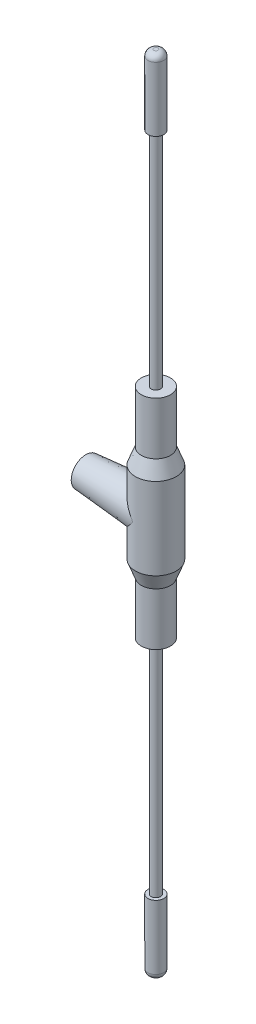
ISO-10303-21;
HEADER;
FILE_DESCRIPTION(('STEP AP214'),'2;1');
FILE_NAME('part.step','',(''),(''),'','','');
FILE_SCHEMA(('AUTOMOTIVE_DESIGN { 1 0 10303 214 1 1 1 1 }'));
ENDSEC;
DATA;
#1=APPLICATION_CONTEXT('core data for automotive mechanical design processes');
#2=APPLICATION_PROTOCOL_DEFINITION('international standard','automotive_design',2000,#1);
#3=PRODUCT_CONTEXT('',#1,'mechanical');
#4=PRODUCT('Part','Part','',(#3));
#5=PRODUCT_RELATED_PRODUCT_CATEGORY('part','',(#4));
#6=PRODUCT_DEFINITION_FORMATION('','',#4);
#7=PRODUCT_DEFINITION_CONTEXT('part definition',#1,'design');
#8=PRODUCT_DEFINITION('design','',#6,#7);
#9=PRODUCT_DEFINITION_SHAPE('','',#8);
#10=(LENGTH_UNIT() NAMED_UNIT(*) SI_UNIT(.MILLI.,.METRE.));
#11=(NAMED_UNIT(*) PLANE_ANGLE_UNIT() SI_UNIT($,.RADIAN.));
#12=(NAMED_UNIT(*) SI_UNIT($,.STERADIAN.) SOLID_ANGLE_UNIT());
#13=UNCERTAINTY_MEASURE_WITH_UNIT(LENGTH_MEASURE(1.E-05),#10,'distance_accuracy_value','');
#14=(GEOMETRIC_REPRESENTATION_CONTEXT(3) GLOBAL_UNCERTAINTY_ASSIGNED_CONTEXT((#13)) GLOBAL_UNIT_ASSIGNED_CONTEXT((#10,
#11,#12)) REPRESENTATION_CONTEXT('',''));
#15=CARTESIAN_POINT('',(0.,0.,0.));
#16=DIRECTION('',(0.,0.,1.));
#17=DIRECTION('',(1.,0.,0.));
#18=AXIS2_PLACEMENT_3D('',#15,#16,#17);
#19=CARTESIAN_POINT('',(-1.34999999999999,-68.6450530372502,0.));
#20=DIRECTION('',(0.,-1.,0.));
#21=DIRECTION('',(1.,0.,0.));
#22=AXIS2_PLACEMENT_3D('',#19,#20,#21);
#23=PLANE('',#22);
#24=CARTESIAN_POINT('',(0.,-68.6450530372502,0.));
#25=DIRECTION('',(0.,-1.,0.));
#26=DIRECTION('',(1.,0.,0.));
#27=AXIS2_PLACEMENT_3D('',#24,#25,#26);
#28=CIRCLE('',#27,0.350000000000007);
#29=CARTESIAN_POINT('',(0.350000000000024,-68.6450530372502,0.));
#30=VERTEX_POINT('',#29);
#31=EDGE_CURVE('E11',#30,#30,#28,.T.);
#32=ORIENTED_EDGE('',*,*,#31,.T.);
#33=EDGE_LOOP('',(#32));
#34=FACE_BOUND('',#33,.T.);
#35=ADVANCED_FACE('F37',(#34),#23,.T.);
#36=CARTESIAN_POINT('',(-1.35000000000001,68.6450530372502,0.));
#37=DIRECTION('',(0.,1.,0.));
#38=DIRECTION('',(-1.,0.,0.));
#39=AXIS2_PLACEMENT_3D('',#36,#37,#38);
#40=PLANE('',#39);
#41=CARTESIAN_POINT('',(0.,68.6450530372502,0.));
#42=DIRECTION('',(0.,1.,0.));
#43=DIRECTION('',(-1.,0.,0.));
#44=AXIS2_PLACEMENT_3D('',#41,#42,#43);
#45=CIRCLE('',#44,0.349999999999991);
#46=CARTESIAN_POINT('',(-0.350000000000008,68.6450530372502,0.));
#47=VERTEX_POINT('',#46);
#48=EDGE_CURVE('E93',#47,#47,#45,.T.);
#49=ORIENTED_EDGE('',*,*,#48,.T.);
#50=EDGE_LOOP('',(#49));
#51=FACE_BOUND('',#50,.T.);
#52=ADVANCED_FACE('F134',(#51),#40,.T.);
#53=CARTESIAN_POINT('',(0.,68.6450530372502,0.));
#54=DIRECTION('',(0.,1.,0.));
#55=DIRECTION('',(-1.,0.,0.));
#56=AXIS2_PLACEMENT_3D('',#53,#54,#55);
#57=CYLINDRICAL_SURFACE('',#56,1.34999999999999);
#58=CARTESIAN_POINT('',(0.,67.6450530372502,0.));
#59=DIRECTION('',(0.,1.,0.));
#60=DIRECTION('',(-1.,0.,0.));
#61=AXIS2_PLACEMENT_3D('',#58,#59,#60);
#62=CIRCLE('',#61,1.34999999999999);
#63=CARTESIAN_POINT('',(-1.35000000000001,67.6450530372502,0.));
#64=VERTEX_POINT('',#63);
#65=EDGE_CURVE('E153',#64,#64,#62,.F.);
#66=ORIENTED_EDGE('',*,*,#65,.T.);
#67=EDGE_LOOP('',(#66));
#68=FACE_BOUND('',#67,.T.);
#69=CARTESIAN_POINT('',(0.,56.6450530372502,0.));
#70=DIRECTION('',(0.,1.,0.));
#71=DIRECTION('',(-1.,0.,0.));
#72=AXIS2_PLACEMENT_3D('',#69,#70,#71);
#73=CIRCLE('',#72,1.34999999999999);
#74=CARTESIAN_POINT('',(-1.35000000000001,56.6450530372502,0.));
#75=VERTEX_POINT('',#74);
#76=EDGE_CURVE('E83',#75,#75,#73,.T.);
#77=ORIENTED_EDGE('',*,*,#76,.T.);
#78=EDGE_LOOP('',(#77));
#79=FACE_BOUND('',#78,.T.);
#80=ADVANCED_FACE('F140',(#68,#79),#57,.T.);
#81=CARTESIAN_POINT('',(-0.800000000000006,56.6450530372502,0.));
#82=DIRECTION('',(0.,-1.,0.));
#83=DIRECTION('',(1.,0.,0.));
#84=AXIS2_PLACEMENT_3D('',#81,#82,#83);
#85=PLANE('',#84);
#86=CARTESIAN_POINT('',(0.,56.6450530372502,0.));
#87=DIRECTION('',(0.,1.,0.));
#88=DIRECTION('',(-1.,0.,0.));
#89=AXIS2_PLACEMENT_3D('',#86,#87,#88);
#90=CIRCLE('',#89,0.799999999999993);
#91=CARTESIAN_POINT('',(-0.800000000000006,56.6450530372502,0.));
#92=VERTEX_POINT('',#91);
#93=EDGE_CURVE('E80',#92,#92,#90,.T.);
#94=ORIENTED_EDGE('',*,*,#93,.T.);
#95=EDGE_LOOP('',(#94));
#96=FACE_BOUND('',#95,.T.);
#97=ORIENTED_EDGE('',*,*,#76,.F.);
#98=EDGE_LOOP('',(#97));
#99=FACE_BOUND('',#98,.T.);
#100=ADVANCED_FACE('F189',(#96,#99),#85,.T.);
#101=CARTESIAN_POINT('',(0.,68.6450530372502,0.));
#102=DIRECTION('',(0.,1.,0.));
#103=DIRECTION('',(-1.,0.,0.));
#104=AXIS2_PLACEMENT_3D('',#101,#102,#103);
#105=CYLINDRICAL_SURFACE('',#104,0.799999999999995);
#106=CARTESIAN_POINT('',(0.,18.6450530372502,0.));
#107=DIRECTION('',(0.,1.,0.));
#108=DIRECTION('',(-1.,0.,0.));
#109=AXIS2_PLACEMENT_3D('',#106,#107,#108);
#110=CIRCLE('',#109,0.799999999999997);
#111=CARTESIAN_POINT('',(-0.800000000000002,18.6450530372502,0.));
#112=VERTEX_POINT('',#111);
#113=EDGE_CURVE('E77',#112,#112,#110,.T.);
#114=ORIENTED_EDGE('',*,*,#113,.T.);
#115=EDGE_LOOP('',(#114));
#116=FACE_BOUND('',#115,.T.);
#117=ORIENTED_EDGE('',*,*,#93,.F.);
#118=EDGE_LOOP('',(#117));
#119=FACE_BOUND('',#118,.T.);
#120=ADVANCED_FACE('F193',(#116,#119),#105,.T.);
#121=CARTESIAN_POINT('',(-2.5,18.6450530372502,0.));
#122=DIRECTION('',(0.,1.,0.));
#123=DIRECTION('',(-1.,0.,0.));
#124=AXIS2_PLACEMENT_3D('',#121,#122,#123);
#125=PLANE('',#124);
#126=CARTESIAN_POINT('',(0.,18.6450530372502,0.));
#127=DIRECTION('',(0.,1.,0.));
#128=DIRECTION('',(-1.,0.,0.));
#129=AXIS2_PLACEMENT_3D('',#126,#127,#128);
#130=CIRCLE('',#129,2.5);
#131=CARTESIAN_POINT('',(-2.5,18.6450530372502,0.));
#132=VERTEX_POINT('',#131);
#133=EDGE_CURVE('E69',#132,#132,#130,.T.);
#134=ORIENTED_EDGE('',*,*,#133,.T.);
#135=EDGE_LOOP('',(#134));
#136=FACE_BOUND('',#135,.T.);
#137=ORIENTED_EDGE('',*,*,#113,.F.);
#138=EDGE_LOOP('',(#137));
#139=FACE_BOUND('',#138,.T.);
#140=ADVANCED_FACE('F199',(#136,#139),#125,.T.);
#141=CARTESIAN_POINT('',(0.,68.6450530372502,0.));
#142=DIRECTION('',(0.,1.,0.));
#143=DIRECTION('',(-1.,0.,0.));
#144=AXIS2_PLACEMENT_3D('',#141,#142,#143);
#145=CYLINDRICAL_SURFACE('',#144,2.5);
#146=CARTESIAN_POINT('',(0.,9.64505303725015,0.));
#147=DIRECTION('',(0.,1.,0.));
#148=DIRECTION('',(-1.,0.,0.));
#149=AXIS2_PLACEMENT_3D('',#146,#147,#148);
#150=CIRCLE('',#149,2.5);
#151=CARTESIAN_POINT('',(-2.5,9.64505303725015,0.));
#152=VERTEX_POINT('',#151);
#153=EDGE_CURVE('E66',#152,#152,#150,.T.);
#154=ORIENTED_EDGE('',*,*,#153,.T.);
#155=EDGE_LOOP('',(#154));
#156=FACE_BOUND('',#155,.T.);
#157=ORIENTED_EDGE('',*,*,#133,.F.);
#158=EDGE_LOOP('',(#157));
#159=FACE_BOUND('',#158,.T.);
#160=ADVANCED_FACE('F205',(#156,#159),#145,.T.);
#161=CARTESIAN_POINT('',(0.,9.64505303725015,0.));
#162=DIRECTION('',(0.,-1.,0.));
#163=DIRECTION('',(1.,0.,0.));
#164=AXIS2_PLACEMENT_3D('',#161,#162,#163);
#165=CONICAL_SURFACE('',#164,2.5,0.361454428294699);
#166=CARTESIAN_POINT('',(0.,7.,0.));
#167=DIRECTION('',(0.,1.,0.));
#168=DIRECTION('',(-1.,0.,0.));
#169=AXIS2_PLACEMENT_3D('',#166,#167,#168);
#170=CIRCLE('',#169,3.5);
#171=CARTESIAN_POINT('',(-3.5,7.,0.));
#172=VERTEX_POINT('',#171);
#173=EDGE_CURVE('E64',#172,#172,#170,.T.);
#174=ORIENTED_EDGE('',*,*,#173,.T.);
#175=EDGE_LOOP('',(#174));
#176=FACE_BOUND('',#175,.T.);
#177=ORIENTED_EDGE('',*,*,#153,.F.);
#178=EDGE_LOOP('',(#177));
#179=FACE_BOUND('',#178,.T.);
#180=ADVANCED_FACE('F55',(#176,#179),#165,.T.);
#181=CARTESIAN_POINT('',(0.,68.6450530372502,0.));
#182=DIRECTION('',(0.,1.,0.));
#183=DIRECTION('',(-1.,0.,0.));
#184=AXIS2_PLACEMENT_3D('',#181,#182,#183);
#185=CYLINDRICAL_SURFACE('',#184,3.5);
#186=CARTESIAN_POINT('',(-2.60949614906665,-2.30966492206223,-2.33249434040178));
#187=CARTESIAN_POINT('',(-2.71781953404462,-2.41922122019186,-2.21130710868468));
#188=CARTESIAN_POINT('',(-2.82046544399447,-2.52291694360074,-2.07950173189472));
#189=CARTESIAN_POINT('',(-3.00990191549178,-2.71417691355314,-1.79436152301762));
#190=CARTESIAN_POINT('',(-3.09670336323236,-2.80175223622898,-1.64104160192255));
#191=CARTESIAN_POINT('',(-3.23320236863166,-2.93942074873517,-1.34789013030215));
#192=CARTESIAN_POINT('',(-3.28686100446216,-2.99352014967703,-1.21183303257941));
#193=CARTESIAN_POINT('',(-3.35497457927908,-3.06218160967978,-0.999837714506521));
#194=CARTESIAN_POINT('',(-3.37561872546223,-3.08298952212982,-0.92784372701138));
#195=CARTESIAN_POINT('',(-3.4124438241706,-3.12010418541856,-0.781602624902478));
#196=CARTESIAN_POINT('',(-3.4286267097356,-3.13641288574346,-0.707356501655439));
#197=CARTESIAN_POINT('',(-3.45632157179874,-3.16432177733867,-0.556561005602214));
#198=CARTESIAN_POINT('',(-3.46779961612868,-3.17588776351682,-0.479999034473181));
#199=CARTESIAN_POINT('',(-3.48567555165178,-3.19390020587876,-0.32571995651793));
#200=CARTESIAN_POINT('',(-3.49207574628518,-3.20034898335722,-0.248003389763019));
#201=CARTESIAN_POINT('',(-3.49965948268216,-3.20799025631259,-0.0920532082651245));
#202=CARTESIAN_POINT('',(-3.50084309903998,-3.2091828269504,-0.0138196009315634));
#203=CARTESIAN_POINT('',(-3.49797535310031,-3.20629333983764,0.142428590227469));
#204=CARTESIAN_POINT('',(-3.49392438598221,-3.20221168025953,0.220443190141096));
#205=CARTESIAN_POINT('',(-3.47539018983816,-3.18353652254281,0.43713126191369));
#206=CARTESIAN_POINT('',(-3.45518457792113,-3.16317686092761,0.574894234541606));
#207=CARTESIAN_POINT('',(-3.39951982661579,-3.10707957355299,0.843917785784003));
#208=CARTESIAN_POINT('',(-3.36405804736898,-3.07133928639905,0.975177234672558));
#209=CARTESIAN_POINT('',(-3.27783084739847,-2.9844158091981,1.23510678029004));
#210=CARTESIAN_POINT('',(-3.22639153749221,-2.9325524881658,1.36332277840809));
#211=CARTESIAN_POINT('',(-3.11154549449944,-2.81672054769149,1.60830206683396));
#212=CARTESIAN_POINT('',(-3.04813329002579,-2.7527463937918,1.72506008384132));
#213=CARTESIAN_POINT('',(-2.87392637422232,-2.57691475369059,2.00781486989971));
#214=CARTESIAN_POINT('',(-2.75630973218524,-2.45813016894066,2.16537517206756));
#215=CARTESIAN_POINT('',(-2.56799566202664,-2.267699403118,2.38002757625814));
#216=CARTESIAN_POINT('',(-2.5031087910283,-2.20204437026227,2.44807168614128));
#217=CARTESIAN_POINT('',(-2.37000841451182,-2.06725059471422,2.57713763322638));
#218=CARTESIAN_POINT('',(-2.30179506857581,-1.99811201913384,2.63815980682322));
#219=CARTESIAN_POINT('',(-2.13637995844069,-1.83024658018113,2.77513628837944));
#220=CARTESIAN_POINT('',(-2.03796445909086,-1.73021141954932,2.84801959413556));
#221=CARTESIAN_POINT('',(-1.83733246298702,-1.52571205438781,2.98139493531115));
#222=CARTESIAN_POINT('',(-1.73511381573173,-1.42124533919579,3.04187983022352));
#223=CARTESIAN_POINT('',(-1.52838436378199,-1.20876743126781,3.15082390940085));
#224=CARTESIAN_POINT('',(-1.42387715670192,-1.10076168543886,3.19930067392478));
#225=CARTESIAN_POINT('',(-1.21387364107492,-0.881325760814849,3.28470047331082));
#226=CARTESIAN_POINT('',(-1.10837814733583,-0.769898255497645,3.32163228827582));
#227=CARTESIAN_POINT('',(-0.962629666966195,-0.609805444834193,3.36530252906266));
#228=CARTESIAN_POINT('',(-0.921152957515908,-0.56353126142878,3.37687455407678));
#229=CARTESIAN_POINT('',(-0.839360387986565,-0.469425044482306,3.39812306410195));
#230=CARTESIAN_POINT('',(-0.799045548938595,-0.421591714986809,3.40779792279015));
#231=CARTESIAN_POINT('',(-0.738272690180344,-0.344181682477016,3.42132595744596));
#232=CARTESIAN_POINT('',(-0.716724726490901,-0.31559016769022,3.42589454089639));
#233=CARTESIAN_POINT('',(-0.675653364742439,-0.256894680153938,3.43422814650198));
#234=CARTESIAN_POINT('',(-0.656125727548742,-0.226794079440237,3.43799486948422));
#235=CARTESIAN_POINT('',(-0.628066201662092,-0.176301667412165,3.4432038167172));
#236=CARTESIAN_POINT('',(-0.61821444284516,-0.156696257074171,3.44497992036702));
#237=CARTESIAN_POINT('',(-0.601123465939705,-0.116340233588428,3.44800311255474));
#238=CARTESIAN_POINT('',(-0.593876585234409,-0.0955931898253101,3.44925175462596));
#239=CARTESIAN_POINT('',(-0.584548290155964,-0.0577755391156096,3.45084358146755));
#240=CARTESIAN_POINT('',(-0.581676088810319,-0.040914711325907,3.45132645755126));
#241=CARTESIAN_POINT('',(-0.578905462143215,-0.00695541568091769,3.45179243622523));
#242=CARTESIAN_POINT('',(-0.579002041902626,0.010142604647835,3.45177637826228));
#243=CARTESIAN_POINT('',(-0.582125054166049,0.0439910793076151,3.45125077458377));
#244=CARTESIAN_POINT('',(-0.585142637381841,0.0607424273681859,3.45074271939014));
#245=CARTESIAN_POINT('',(-0.593556528094491,0.093629943363963,3.44930570666274));
#246=CARTESIAN_POINT('',(-0.598958411608624,0.109764572330099,3.4483757623399));
#247=CARTESIAN_POINT('',(-0.622380880254753,0.169217942813282,3.44426023686765));
#248=CARTESIAN_POINT('',(-0.645833747825696,0.210199929662712,3.43999229679418));
#249=CARTESIAN_POINT('',(-0.697191911248009,0.289179506090962,3.42996277964079));
#250=CARTESIAN_POINT('',(-0.725140375737289,0.327142204487347,3.42418634285844));
#251=CARTESIAN_POINT('',(-0.78676956543944,0.406246381828381,3.41058815571182));
#252=CARTESIAN_POINT('',(-0.820721670574929,0.447153132594018,3.40259762461275));
#253=CARTESIAN_POINT('',(-0.889718396711673,0.527735832461666,3.38521459967457));
#254=CARTESIAN_POINT('',(-0.924763825221643,0.567410826491635,3.37582104922151));
#255=CARTESIAN_POINT('',(-1.03073814554478,0.685364235218359,3.34558865476176));
#256=CARTESIAN_POINT('',(-1.10241430197052,0.762462969004495,3.32271756243427));
#257=CARTESIAN_POINT('',(-1.24568146718776,0.91455745592573,3.27170782240247));
#258=CARTESIAN_POINT('',(-1.31727222239841,0.989558098438658,3.24358284428107));
#259=CARTESIAN_POINT('',(-1.45981655658942,1.13784460661524,3.18197377911078));
#260=CARTESIAN_POINT('',(-1.53077052528836,1.21113157245469,3.14849324497665));
#261=CARTESIAN_POINT('',(-1.69903338507688,1.3842504271775,3.06192706322867));
#262=CARTESIAN_POINT('',(-1.79584421084335,1.48330438038636,3.00628430957384));
#263=CARTESIAN_POINT('',(-1.98635024968953,1.6776725206095,2.88396229580617));
#264=CARTESIAN_POINT('',(-2.08004367983374,1.77298457293655,2.81727684604077));
#265=CARTESIAN_POINT('',(-2.26305466430302,1.95884403601416,2.67248606250255));
#266=CARTESIAN_POINT('',(-2.35237659053347,2.04939621407898,2.59439246293458));
#267=CARTESIAN_POINT('',(-2.52535379940022,2.22457059558746,2.42633918170663));
#268=CARTESIAN_POINT('',(-2.60901319040374,2.30919709988697,2.33638824570698));
#269=CARTESIAN_POINT('',(-2.78847587217008,2.49060862314382,2.12096723890712));
#270=CARTESIAN_POINT('',(-2.88234988829161,2.58541176788445,1.99216064485974));
#271=CARTESIAN_POINT('',(-3.05503678374751,2.75971861659173,1.71559334540337));
#272=CARTESIAN_POINT('',(-3.13387298800664,2.83924601590083,1.5678625978975));
#273=CARTESIAN_POINT('',(-3.26039728243529,2.96684105538658,1.28067010422609));
#274=CARTESIAN_POINT('',(-3.3110847339662,3.0179407630374,1.14391633045995));
#275=CARTESIAN_POINT('',(-3.37462376375616,3.08198684291185,0.93134776494629));
#276=CARTESIAN_POINT('',(-3.39372516242452,3.10123873022476,0.85922980931241));
#277=CARTESIAN_POINT('',(-3.42744312896855,3.13522025196905,0.71292258430573));
#278=CARTESIAN_POINT('',(-3.44206163797803,3.14995184373303,0.6387342266623));
#279=CARTESIAN_POINT('',(-3.46661262161866,3.17469177163347,0.488306245256146));
#280=CARTESIAN_POINT('',(-3.47651449790497,3.18466926650622,0.412056530122202));
#281=CARTESIAN_POINT('',(-3.4912832207013,3.19955049089204,0.258611013343632));
#282=CARTESIAN_POINT('',(-3.49615228444511,3.20445645469667,0.18141564349249));
#283=CARTESIAN_POINT('',(-3.50075296778359,3.20909201296992,0.0267114616619918));
#284=CARTESIAN_POINT('',(-3.50048460408674,3.2088216242736,-0.0507973492971384));
#285=CARTESIAN_POINT('',(-3.4948250096166,3.2031191086893,-0.205412343905618));
#286=CARTESIAN_POINT('',(-3.48943411276203,3.19768731825373,-0.282518553469621));
#287=CARTESIAN_POINT('',(-3.4672565376507,3.17534072472731,-0.497377504936457));
#288=CARTESIAN_POINT('',(-3.44479136915351,3.15270372351301,-0.634023095062513));
#289=CARTESIAN_POINT('',(-3.38495755560253,3.092402908041,-0.900424574482895));
#290=CARTESIAN_POINT('',(-3.34758598121708,3.05473614020888,-1.0301791038982));
#291=CARTESIAN_POINT('',(-3.25726892327002,2.96368471204027,-1.28843251062069));
#292=CARTESIAN_POINT('',(-3.20349366529789,2.90946240797821,-1.41634221965479));
#293=CARTESIAN_POINT('',(-3.08411426670854,2.789047282223,-1.66034212204034));
#294=CARTESIAN_POINT('',(-3.01850471814211,2.72284898778638,-1.77642687360032));
#295=CARTESIAN_POINT('',(-2.83785226080649,2.54048609595921,-2.05874545580744));
#296=CARTESIAN_POINT('',(-2.7158790762913,2.4172783503192,-2.21607527312337));
#297=CARTESIAN_POINT('',(-2.52111716883902,2.22026734579953,-2.4296762237788));
#298=CARTESIAN_POINT('',(-2.45408614161922,2.1524184102102,-2.49725483405189));
#299=CARTESIAN_POINT('',(-2.31673775959071,2.01325804327434,-2.625170305153));
#300=CARTESIAN_POINT('',(-2.24642049045298,1.94194670218943,-2.68550735461939));
#301=CARTESIAN_POINT('',(-2.07639818374142,1.76928804612033,-2.82034477674984));
#302=CARTESIAN_POINT('',(-1.97551895242748,1.66666307831179,-2.89172772344638));
#303=CARTESIAN_POINT('',(-1.77015320032139,1.45704305324458,-3.02181099122809));
#304=CARTESIAN_POINT('',(-1.66566508926506,1.35004606553998,-3.08050563630117));
#305=CARTESIAN_POINT('',(-1.45463774687206,1.1326035996737,-3.18557052171892));
#306=CARTESIAN_POINT('',(-1.34810354120317,1.02216623773275,-3.23196762761589));
#307=CARTESIAN_POINT('',(-1.18809350595403,0.853573746701477,-3.29267333161253));
#308=CARTESIAN_POINT('',(-1.13471762199692,0.796882037317633,-3.31142808907757));
#309=CARTESIAN_POINT('',(-1.02836250444108,0.68224426246676,-3.34598014333621));
#310=CARTESIAN_POINT('',(-0.975383179027257,0.624298500251966,-3.36177814640435));
#311=CARTESIAN_POINT('',(-0.887777417363474,0.525428628414402,-3.38573496347006));
#312=CARTESIAN_POINT('',(-0.852751669468628,0.485053737859607,-3.39471282062441));
#313=CARTESIAN_POINT('',(-0.784152392783869,0.402831821848775,-3.41120703844176));
#314=CARTESIAN_POINT('',(-0.750577158210431,0.360986636650632,-3.41872515424427));
#315=CARTESIAN_POINT('',(-0.700283797411126,0.292547527206041,-3.42928044039058));
#316=CARTESIAN_POINT('',(-0.682395958804961,0.266907799577191,-3.43287541405798));
#317=CARTESIAN_POINT('',(-0.648814113161121,0.214078919038872,-3.43937892844614));
#318=CARTESIAN_POINT('',(-0.633119326788893,0.186890321403776,-3.44228771326879));
#319=CARTESIAN_POINT('',(-0.61111382424878,0.14075400414171,-3.44624675538599));
#320=CARTESIAN_POINT('',(-0.603480091659787,0.122481797211757,-3.44758639279448));
#321=CARTESIAN_POINT('',(-0.59093686358519,0.0850094031582989,-3.44975861339184));
#322=CARTESIAN_POINT('',(-0.586018144788897,0.0658126017544061,-3.45059291423727));
#323=CARTESIAN_POINT('',(-0.580341041768719,0.0295633139205476,-3.45155212859246));
#324=CARTESIAN_POINT('',(-0.579090593657584,0.0125939912525814,-3.45176103388426));
#325=CARTESIAN_POINT('',(-0.579594874952973,-0.0212876358410198,-3.45167636967833));
#326=CARTESIAN_POINT('',(-0.581348262274476,-0.0381999623495394,-3.45138302458133));
#327=CARTESIAN_POINT('',(-0.588522701344562,-0.0770541674508179,-3.4501677023245));
#328=CARTESIAN_POINT('',(-0.594972032688519,-0.0987920513311159,-3.44906868048236));
#329=CARTESIAN_POINT('',(-0.611028491866295,-0.141076578971758,-3.44626037126231));
#330=CARTESIAN_POINT('',(-0.620653842305737,-0.161615524022193,-3.44454755721638));
#331=CARTESIAN_POINT('',(-0.649435253034837,-0.216167225285983,-3.43926888715873));
#332=CARTESIAN_POINT('',(-0.670436008446379,-0.249131570425273,-3.43526069257075));
#333=CARTESIAN_POINT('',(-0.714905808313501,-0.313244897306379,-3.42628637304679));
#334=CARTESIAN_POINT('',(-0.73838237069011,-0.344387875813048,-3.42131728988756));
#335=CARTESIAN_POINT('',(-0.810862451825432,-0.436494532694653,-3.40513403191238));
#336=CARTESIAN_POINT('',(-0.861691345462394,-0.495795457585403,-3.39268273300867));
#337=CARTESIAN_POINT('',(-0.964661961071323,-0.612349242425516,-3.36486367991904));
#338=CARTESIAN_POINT('',(-1.01680228699123,-0.669604135260466,-3.3494989219544));
#339=CARTESIAN_POINT('',(-1.12155310218693,-0.782831657344465,-3.31589200652221));
#340=CARTESIAN_POINT('',(-1.17416359968576,-0.838804264105771,-3.29764979863633));
#341=CARTESIAN_POINT('',(-1.33206732280625,-1.00542671098044,-3.23855499650725));
#342=CARTESIAN_POINT('',(-1.43729701364955,-1.11463319924475,-3.19337010489927));
#343=CARTESIAN_POINT('',(-1.6451076680346,-1.32894225646303,-3.09143549708765));
#344=CARTESIAN_POINT('',(-1.74769928634475,-1.4340626939136,-3.03474505040323));
#345=CARTESIAN_POINT('',(-1.94945307754586,-1.6401061910222,-2.90924892820463));
#346=CARTESIAN_POINT('',(-2.04861856008513,-1.74103332166181,-2.84045535936743));
#347=CARTESIAN_POINT('',(-2.2266235990024,-1.92186848816756,-2.70235066586925));
#348=CARTESIAN_POINT('',(-2.30615465209788,-2.0025340689475,-2.63492649230814));
#349=CARTESIAN_POINT('',(-2.46114887041834,-2.15957554358803,-2.49077513260074));
#350=CARTESIAN_POINT('',(-2.536607788002,-2.23594696156274,-2.41403849362056));
#351=CARTESIAN_POINT('',(-2.60949614906665,-2.30966492206223,-2.33249434040178));
#352=B_SPLINE_CURVE_WITH_KNOTS('',3,(#186,#187,#188,#189,#190,#191,#192,#193,#194,#195,#196,
#197,#198,#199,#200,#201,#202,#203,#204,#205,#206,#207,#208,#209,#210,#211,#212,#213,#214,#215,
#216,#217,#218,#219,#220,#221,#222,#223,#224,#225,#226,#227,#228,#229,#230,#231,#232,#233,#234,
#235,#236,#237,#238,#239,#240,#241,#242,#243,#244,#245,#246,#247,#248,#249,#250,#251,#252,#253,
#254,#255,#256,#257,#258,#259,#260,#261,#262,#263,#264,#265,#266,#267,#268,#269,#270,#271,#272,
#273,#274,#275,#276,#277,#278,#279,#280,#281,#282,#283,#284,#285,#286,#287,#288,#289,#290,#291,
#292,#293,#294,#295,#296,#297,#298,#299,#300,#301,#302,#303,#304,#305,#306,#307,#308,#309,#310,
#311,#312,#313,#314,#315,#316,#317,#318,#319,#320,#321,#322,#323,#324,#325,#326,#327,#328,#329,
#330,#331,#332,#333,#334,#335,#336,#337,#338,#339,#340,#341,#342,#343,#344,#345,#346,#347,#348,
#349,#350,#351),.UNSPECIFIED.,.T.,.F.,(4,2,2,2,2,2,2,2,2,2,2,2,2,2,2,2,2,2,2,2,2,2,2,2,2,2,2,2,
2,2,2,2,2,2,2,2,2,2,2,2,2,2,2,2,2,2,2,2,2,2,2,2,2,2,2,2,2,2,2,2,2,2,2,2,2,2,2,2,2,2,2,2,2,2,2,2,
2,2,2,2,2,2,4),(0.,0.587709186042243,1.17501304452192,1.64078096157125,1.87372996931262,
2.10657788230983,2.3410767791915,2.57546924056287,2.80985835023791,3.04422976598699,
3.46428506995355,3.88441308765098,4.32545329078819,4.7666955309419,5.45172279774003,
5.7955389181961,6.1393385608363,6.61305321174101,7.08703992312637,7.56032854718177,
8.03325634766969,8.22286443028851,8.41263434832163,8.52087662261212,8.62888696460616,
8.69481623746831,8.76054995149918,8.81164989614923,8.86266387080363,8.91352377886619,
8.96450326535406,9.10555343417124,9.24804919905742,9.40920497061662,9.57048272632512,
9.89346503520243,10.2156184248627,10.5375589752858,10.9848827138361,11.4324580403324,
11.8795761992455,12.326366401728,12.8807844065352,13.4343353416907,13.8958644706681,
14.1267637410854,14.3575628882867,14.5898395739444,14.8220138851335,15.0541874412214,
15.2863458638246,15.7052485953399,16.1242336880957,16.5694971820348,17.014964667174,
17.7131136982449,18.0635679045676,18.4140129797826,18.8952389367024,19.3766797228311,
19.85705990504,20.0972896878863,20.337462014039,20.5000376285325,20.662416540846,
20.7567743243938,20.8510984907196,20.9105027263912,20.9697038950184,21.0204882666252,
21.0712499541761,21.1389432897586,21.2070319770941,21.3245730889565,21.4424819998075,
21.6795241789065,21.9163238915019,22.1531277537339,22.6273458334322,23.0991803624686,
23.5705455743781,23.9655974075321,24.3610536551555),.UNSPECIFIED.);
#353=CARTESIAN_POINT('',(-2.60949614906665,-2.30966492206223,-2.33249434040178));
#354=VERTEX_POINT('',#353);
#355=EDGE_CURVE('E86',#354,#354,#352,.T.);
#356=ORIENTED_EDGE('',*,*,#355,.F.);
#357=EDGE_LOOP('',(#356));
#358=FACE_BOUND('',#357,.T.);
#359=CARTESIAN_POINT('',(0.,0.,-3.5));
#360=VERTEX_POINT('',#359);
#361=VERTEX_LOOP('',#360);
#362=FACE_BOUND('',#361,.T.);
#363=CARTESIAN_POINT('',(0.,0.,3.5));
#364=VERTEX_POINT('',#363);
#365=VERTEX_LOOP('',#364);
#366=FACE_BOUND('',#365,.T.);
#367=CARTESIAN_POINT('',(0.,-6.99999999999999,0.));
#368=DIRECTION('',(0.,1.,0.));
#369=DIRECTION('',(-1.,0.,0.));
#370=AXIS2_PLACEMENT_3D('',#367,#368,#369);
#371=CIRCLE('',#370,3.5);
#372=CARTESIAN_POINT('',(-3.5,-6.99999999999999,0.));
#373=VERTEX_POINT('',#372);
#374=EDGE_CURVE('E61',#373,#373,#371,.T.);
#375=ORIENTED_EDGE('',*,*,#374,.T.);
#376=EDGE_LOOP('',(#375));
#377=FACE_BOUND('',#376,.T.);
#378=ORIENTED_EDGE('',*,*,#173,.F.);
#379=EDGE_LOOP('',(#378));
#380=FACE_BOUND('',#379,.T.);
#381=ADVANCED_FACE('F51',(#358,#362,#366,#377,#380),#185,.T.);
#382=CARTESIAN_POINT('',(0.,-6.99999999999999,0.));
#383=DIRECTION('',(0.,1.,0.));
#384=DIRECTION('',(-1.,0.,0.));
#385=AXIS2_PLACEMENT_3D('',#382,#383,#384);
#386=CONICAL_SURFACE('',#385,3.5,0.361454428294698);
#387=CARTESIAN_POINT('',(0.,-9.64505303725015,0.));
#388=DIRECTION('',(0.,1.,0.));
#389=DIRECTION('',(-1.,0.,0.));
#390=AXIS2_PLACEMENT_3D('',#387,#388,#389);
#391=CIRCLE('',#390,2.5);
#392=CARTESIAN_POINT('',(-2.5,-9.64505303725015,0.));
#393=VERTEX_POINT('',#392);
#394=EDGE_CURVE('E71',#393,#393,#391,.T.);
#395=ORIENTED_EDGE('',*,*,#394,.T.);
#396=EDGE_LOOP('',(#395));
#397=FACE_BOUND('',#396,.T.);
#398=ORIENTED_EDGE('',*,*,#374,.F.);
#399=EDGE_LOOP('',(#398));
#400=FACE_BOUND('',#399,.T.);
#401=ADVANCED_FACE('F54',(#397,#400),#386,.T.);
#402=CARTESIAN_POINT('',(0.,68.6450530372502,0.));
#403=DIRECTION('',(0.,1.,0.));
#404=DIRECTION('',(-1.,0.,0.));
#405=AXIS2_PLACEMENT_3D('',#402,#403,#404);
#406=CYLINDRICAL_SURFACE('',#405,2.5);
#407=CARTESIAN_POINT('',(0.,-18.6450530372502,0.));
#408=DIRECTION('',(0.,1.,0.));
#409=DIRECTION('',(-1.,0.,0.));
#410=AXIS2_PLACEMENT_3D('',#407,#408,#409);
#411=CIRCLE('',#410,2.5);
#412=CARTESIAN_POINT('',(-2.5,-18.6450530372502,0.));
#413=VERTEX_POINT('',#412);
#414=EDGE_CURVE('E175',#413,#413,#411,.T.);
#415=ORIENTED_EDGE('',*,*,#414,.T.);
#416=EDGE_LOOP('',(#415));
#417=FACE_BOUND('',#416,.T.);
#418=ORIENTED_EDGE('',*,*,#394,.F.);
#419=EDGE_LOOP('',(#418));
#420=FACE_BOUND('',#419,.T.);
#421=ADVANCED_FACE('F123',(#417,#420),#406,.T.);
#422=CARTESIAN_POINT('',(-2.5,-18.6450530372502,0.));
#423=DIRECTION('',(0.,-1.,0.));
#424=DIRECTION('',(1.,0.,0.));
#425=AXIS2_PLACEMENT_3D('',#422,#423,#424);
#426=PLANE('',#425);
#427=CARTESIAN_POINT('',(0.,-18.6450530372502,0.));
#428=DIRECTION('',(0.,1.,0.));
#429=DIRECTION('',(-1.,0.,0.));
#430=AXIS2_PLACEMENT_3D('',#427,#428,#429);
#431=CIRCLE('',#430,0.800000000000002);
#432=CARTESIAN_POINT('',(-0.799999999999997,-18.6450530372502,0.));
#433=VERTEX_POINT('',#432);
#434=EDGE_CURVE('E168',#433,#433,#431,.T.);
#435=ORIENTED_EDGE('',*,*,#434,.T.);
#436=EDGE_LOOP('',(#435));
#437=FACE_BOUND('',#436,.T.);
#438=ORIENTED_EDGE('',*,*,#414,.F.);
#439=EDGE_LOOP('',(#438));
#440=FACE_BOUND('',#439,.T.);
#441=ADVANCED_FACE('F119',(#437,#440),#426,.T.);
#442=CARTESIAN_POINT('',(0.,68.6450530372502,0.));
#443=DIRECTION('',(0.,1.,0.));
#444=DIRECTION('',(-1.,0.,0.));
#445=AXIS2_PLACEMENT_3D('',#442,#443,#444);
#446=CYLINDRICAL_SURFACE('',#445,0.800000000000004);
#447=CARTESIAN_POINT('',(0.,-56.6450530372502,0.));
#448=DIRECTION('',(0.,1.,0.));
#449=DIRECTION('',(-1.,0.,0.));
#450=AXIS2_PLACEMENT_3D('',#447,#448,#449);
#451=CIRCLE('',#450,0.800000000000007);
#452=CARTESIAN_POINT('',(-0.799999999999992,-56.6450530372502,0.));
#453=VERTEX_POINT('',#452);
#454=EDGE_CURVE('E164',#453,#453,#451,.T.);
#455=ORIENTED_EDGE('',*,*,#454,.T.);
#456=EDGE_LOOP('',(#455));
#457=FACE_BOUND('',#456,.T.);
#458=ORIENTED_EDGE('',*,*,#434,.F.);
#459=EDGE_LOOP('',(#458));
#460=FACE_BOUND('',#459,.T.);
#461=ADVANCED_FACE('F115',(#457,#460),#446,.T.);
#462=CARTESIAN_POINT('',(-0.799999999999992,-56.6450530372502,0.));
#463=DIRECTION('',(0.,1.,0.));
#464=DIRECTION('',(-1.,0.,0.));
#465=AXIS2_PLACEMENT_3D('',#462,#463,#464);
#466=PLANE('',#465);
#467=CARTESIAN_POINT('',(0.,-56.6450530372502,0.));
#468=DIRECTION('',(0.,1.,0.));
#469=DIRECTION('',(-1.,0.,0.));
#470=AXIS2_PLACEMENT_3D('',#467,#468,#469);
#471=CIRCLE('',#470,1.35000000000001);
#472=CARTESIAN_POINT('',(-1.34999999999999,-56.6450530372502,0.));
#473=VERTEX_POINT('',#472);
#474=EDGE_CURVE('E163',#473,#473,#471,.T.);
#475=ORIENTED_EDGE('',*,*,#474,.T.);
#476=EDGE_LOOP('',(#475));
#477=FACE_BOUND('',#476,.T.);
#478=ORIENTED_EDGE('',*,*,#454,.F.);
#479=EDGE_LOOP('',(#478));
#480=FACE_BOUND('',#479,.T.);
#481=ADVANCED_FACE('F111',(#477,#480),#466,.T.);
#482=CARTESIAN_POINT('',(0.,68.6450530372502,0.));
#483=DIRECTION('',(0.,1.,0.));
#484=DIRECTION('',(-1.,0.,0.));
#485=AXIS2_PLACEMENT_3D('',#482,#483,#484);
#486=CYLINDRICAL_SURFACE('',#485,1.35000000000001);
#487=CARTESIAN_POINT('',(0.,-67.6450530372502,0.));
#488=DIRECTION('',(0.,-1.,0.));
#489=DIRECTION('',(1.,0.,0.));
#490=AXIS2_PLACEMENT_3D('',#487,#488,#489);
#491=CIRCLE('',#490,1.35000000000001);
#492=CARTESIAN_POINT('',(1.35000000000002,-67.6450530372502,0.));
#493=VERTEX_POINT('',#492);
#494=EDGE_CURVE('E45',#493,#493,#491,.F.);
#495=ORIENTED_EDGE('',*,*,#494,.T.);
#496=EDGE_LOOP('',(#495));
#497=FACE_BOUND('',#496,.T.);
#498=ORIENTED_EDGE('',*,*,#474,.F.);
#499=EDGE_LOOP('',(#498));
#500=FACE_BOUND('',#499,.T.);
#501=ADVANCED_FACE('F107',(#497,#500),#486,.T.);
#502=CARTESIAN_POINT('',(-12.,0.,0.));
#503=DIRECTION('',(-1.,0.,0.));
#504=DIRECTION('',(0.,-1.,0.));
#505=AXIS2_PLACEMENT_3D('',#502,#503,#504);
#506=PLANE('',#505);
#507=CARTESIAN_POINT('',(-12.,0.,0.));
#508=DIRECTION('',(1.,0.,0.));
#509=DIRECTION('',(0.,1.,0.));
#510=AXIS2_PLACEMENT_3D('',#507,#508,#509);
#511=CIRCLE('',#510,2.5);
#512=CARTESIAN_POINT('',(-12.,2.5,0.));
#513=VERTEX_POINT('',#512);
#514=EDGE_CURVE('E165',#513,#513,#511,.T.);
#515=ORIENTED_EDGE('',*,*,#514,.F.);
#516=EDGE_LOOP('',(#515));
#517=FACE_BOUND('',#516,.T.);
#518=ADVANCED_FACE('F103',(#517),#506,.T.);
#519=CARTESIAN_POINT('',(0.,0.,0.));
#520=DIRECTION('',(1.,0.,0.));
#521=DIRECTION('',(0.,1.,0.));
#522=AXIS2_PLACEMENT_3D('',#519,#520,#521);
#523=CONICAL_SURFACE('',#522,3.5,0.0831412318884412);
#524=ORIENTED_EDGE('',*,*,#355,.T.);
#525=EDGE_LOOP('',(#524));
#526=FACE_BOUND('',#525,.T.);
#527=ORIENTED_EDGE('',*,*,#514,.T.);
#528=EDGE_LOOP('',(#527));
#529=FACE_BOUND('',#528,.T.);
#530=ADVANCED_FACE('F98',(#526,#529),#523,.T.);
#531=CARTESIAN_POINT('',(0.,67.6450530372502,0.));
#532=DIRECTION('',(0.,1.,0.));
#533=DIRECTION('',(-1.,0.,0.));
#534=AXIS2_PLACEMENT_3D('',#531,#532,#533);
#535=DEGENERATE_TOROIDAL_SURFACE('',#534,0.349999999999991,1.,.T.);
#536=ORIENTED_EDGE('',*,*,#65,.F.);
#537=EDGE_LOOP('',(#536));
#538=FACE_BOUND('',#537,.T.);
#539=ORIENTED_EDGE('',*,*,#48,.F.);
#540=EDGE_LOOP('',(#539));
#541=FACE_BOUND('',#540,.T.);
#542=ADVANCED_FACE('F102',(#538,#541),#535,.T.);
#543=CARTESIAN_POINT('',(0.,-67.6450530372502,0.));
#544=DIRECTION('',(0.,-1.,0.));
#545=DIRECTION('',(1.,0.,0.));
#546=AXIS2_PLACEMENT_3D('',#543,#544,#545);
#547=DEGENERATE_TOROIDAL_SURFACE('',#546,0.350000000000007,1.,.T.);
#548=ORIENTED_EDGE('',*,*,#31,.F.);
#549=EDGE_LOOP('',(#548));
#550=FACE_BOUND('',#549,.T.);
#551=ORIENTED_EDGE('',*,*,#494,.F.);
#552=EDGE_LOOP('',(#551));
#553=FACE_BOUND('',#552,.T.);
#554=ADVANCED_FACE('F39',(#550,#553),#547,.T.);
#555=CLOSED_SHELL('',(#35,#52,#80,#100,#120,#140,#160,#180,#381,#401,#421,#441,#461,#481,#501,
#518,#530,#542,#554));
#556=MANIFOLD_SOLID_BREP('B2',#555);
#557=ADVANCED_BREP_SHAPE_REPRESENTATION('',(#18,#556),#14);
#558=SHAPE_DEFINITION_REPRESENTATION(#9,#557);
ENDSEC;
END-ISO-10303-21;
